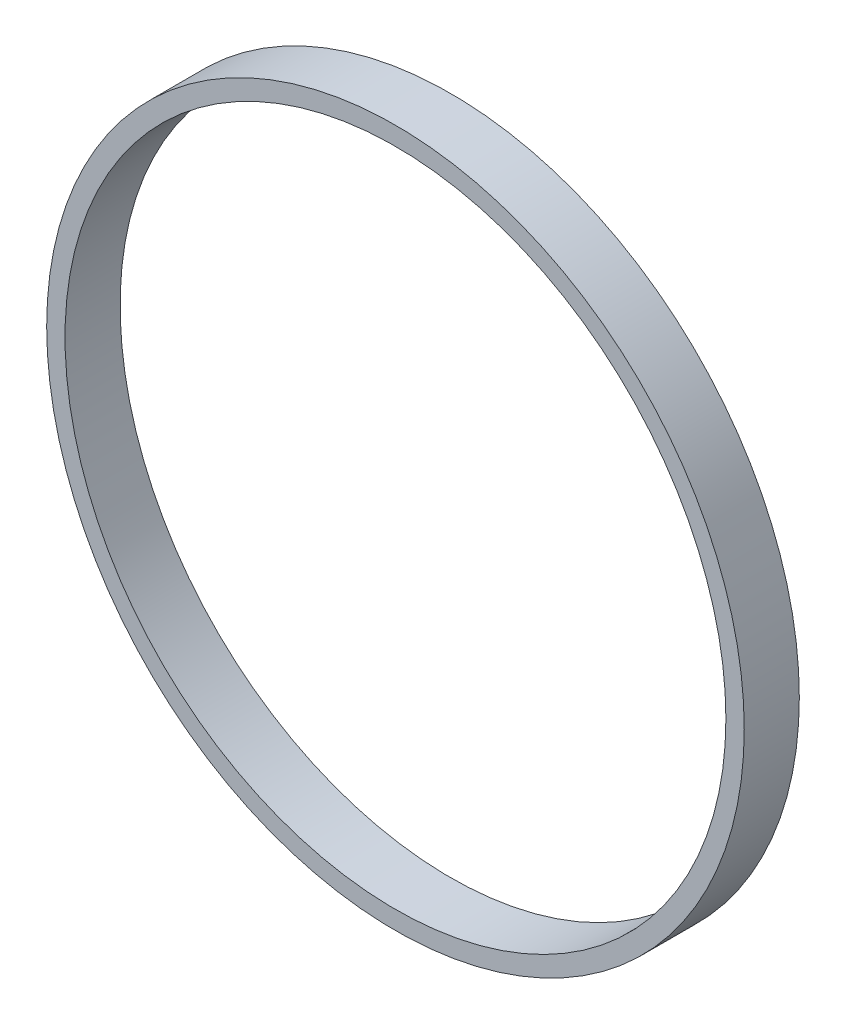
ISO-10303-21;
HEADER;
FILE_DESCRIPTION(('STEP AP214'),'2;1');
FILE_NAME('part.step','',(''),(''),'','','');
FILE_SCHEMA(('AUTOMOTIVE_DESIGN { 1 0 10303 214 1 1 1 1 }'));
ENDSEC;
DATA;
#1=APPLICATION_CONTEXT('core data for automotive mechanical design processes');
#2=APPLICATION_PROTOCOL_DEFINITION('international standard','automotive_design',2000,#1);
#3=PRODUCT_CONTEXT('',#1,'mechanical');
#4=PRODUCT('Part','Part','',(#3));
#5=PRODUCT_RELATED_PRODUCT_CATEGORY('part','',(#4));
#6=PRODUCT_DEFINITION_FORMATION('','',#4);
#7=PRODUCT_DEFINITION_CONTEXT('part definition',#1,'design');
#8=PRODUCT_DEFINITION('design','',#6,#7);
#9=PRODUCT_DEFINITION_SHAPE('','',#8);
#10=(LENGTH_UNIT() NAMED_UNIT(*) SI_UNIT(.MILLI.,.METRE.));
#11=(NAMED_UNIT(*) PLANE_ANGLE_UNIT() SI_UNIT($,.RADIAN.));
#12=(NAMED_UNIT(*) SI_UNIT($,.STERADIAN.) SOLID_ANGLE_UNIT());
#13=UNCERTAINTY_MEASURE_WITH_UNIT(LENGTH_MEASURE(1.E-05),#10,'distance_accuracy_value','');
#14=(GEOMETRIC_REPRESENTATION_CONTEXT(3) GLOBAL_UNCERTAINTY_ASSIGNED_CONTEXT((#13)) GLOBAL_UNIT_ASSIGNED_CONTEXT((#10,
#11,#12)) REPRESENTATION_CONTEXT('',''));
#15=CARTESIAN_POINT('',(0.,0.,0.));
#16=DIRECTION('',(0.,0.,1.));
#17=DIRECTION('',(1.,0.,0.));
#18=AXIS2_PLACEMENT_3D('',#15,#16,#17);
#19=CARTESIAN_POINT('',(0.,0.,0.75));
#20=DIRECTION('',(0.,0.,-1.));
#21=DIRECTION('',(-1.,0.,0.));
#22=AXIS2_PLACEMENT_3D('',#19,#20,#21);
#23=CYLINDRICAL_SURFACE('',#22,4.75);
#24=CARTESIAN_POINT('',(0.,0.,0.75));
#25=DIRECTION('',(0.,0.,1.));
#26=DIRECTION('',(1.,0.,0.));
#27=AXIS2_PLACEMENT_3D('',#24,#25,#26);
#28=CIRCLE('',#27,4.75);
#29=CARTESIAN_POINT('',(4.75,0.,0.75));
#30=VERTEX_POINT('',#29);
#31=EDGE_CURVE('E10',#30,#30,#28,.T.);
#32=ORIENTED_EDGE('',*,*,#31,.F.);
#33=EDGE_LOOP('',(#32));
#34=FACE_BOUND('',#33,.T.);
#35=CARTESIAN_POINT('',(0.,0.,0.));
#36=DIRECTION('',(0.,0.,1.));
#37=DIRECTION('',(1.,0.,0.));
#38=AXIS2_PLACEMENT_3D('',#35,#36,#37);
#39=CIRCLE('',#38,4.75);
#40=CARTESIAN_POINT('',(4.75,0.,0.));
#41=VERTEX_POINT('',#40);
#42=EDGE_CURVE('E35',#41,#41,#39,.T.);
#43=ORIENTED_EDGE('',*,*,#42,.T.);
#44=EDGE_LOOP('',(#43));
#45=FACE_BOUND('',#44,.T.);
#46=ADVANCED_FACE('F32',(#34,#45),#23,.T.);
#47=CARTESIAN_POINT('',(0.,0.,0.75));
#48=DIRECTION('',(0.,0.,1.));
#49=DIRECTION('',(1.,0.,0.));
#50=AXIS2_PLACEMENT_3D('',#47,#48,#49);
#51=PLANE('',#50);
#52=CARTESIAN_POINT('',(0.,0.,0.75));
#53=DIRECTION('',(0.,0.,1.));
#54=DIRECTION('',(1.,0.,0.));
#55=AXIS2_PLACEMENT_3D('',#52,#53,#54);
#56=CIRCLE('',#55,4.5);
#57=CARTESIAN_POINT('',(4.5,0.,0.75));
#58=VERTEX_POINT('',#57);
#59=EDGE_CURVE('E44',#58,#58,#56,.T.);
#60=ORIENTED_EDGE('',*,*,#59,.F.);
#61=EDGE_LOOP('',(#60));
#62=FACE_BOUND('',#61,.T.);
#63=ORIENTED_EDGE('',*,*,#31,.T.);
#64=EDGE_LOOP('',(#63));
#65=FACE_BOUND('',#64,.T.);
#66=ADVANCED_FACE('F59',(#62,#65),#51,.T.);
#67=CARTESIAN_POINT('',(0.,0.,0.));
#68=DIRECTION('',(0.,0.,1.));
#69=DIRECTION('',(1.,0.,0.));
#70=AXIS2_PLACEMENT_3D('',#67,#68,#69);
#71=PLANE('',#70);
#72=CARTESIAN_POINT('',(0.,0.,0.));
#73=DIRECTION('',(0.,0.,1.));
#74=DIRECTION('',(1.,0.,0.));
#75=AXIS2_PLACEMENT_3D('',#72,#73,#74);
#76=CIRCLE('',#75,4.5);
#77=CARTESIAN_POINT('',(4.5,0.,0.));
#78=VERTEX_POINT('',#77);
#79=EDGE_CURVE('E42',#78,#78,#76,.T.);
#80=ORIENTED_EDGE('',*,*,#79,.T.);
#81=EDGE_LOOP('',(#80));
#82=FACE_BOUND('',#81,.T.);
#83=ORIENTED_EDGE('',*,*,#42,.F.);
#84=EDGE_LOOP('',(#83));
#85=FACE_BOUND('',#84,.T.);
#86=ADVANCED_FACE('F50',(#82,#85),#71,.F.);
#87=CARTESIAN_POINT('',(0.,0.,0.));
#88=DIRECTION('',(0.,0.,1.));
#89=DIRECTION('',(1.,0.,0.));
#90=AXIS2_PLACEMENT_3D('',#87,#88,#89);
#91=CYLINDRICAL_SURFACE('',#90,4.5);
#92=ORIENTED_EDGE('',*,*,#79,.F.);
#93=EDGE_LOOP('',(#92));
#94=FACE_BOUND('',#93,.T.);
#95=ORIENTED_EDGE('',*,*,#59,.T.);
#96=EDGE_LOOP('',(#95));
#97=FACE_BOUND('',#96,.T.);
#98=ADVANCED_FACE('F53',(#94,#97),#91,.F.);
#99=CLOSED_SHELL('',(#46,#66,#86,#98));
#100=MANIFOLD_SOLID_BREP('B2',#99);
#101=ADVANCED_BREP_SHAPE_REPRESENTATION('',(#18,#100),#14);
#102=SHAPE_DEFINITION_REPRESENTATION(#9,#101);
ENDSEC;
END-ISO-10303-21;
